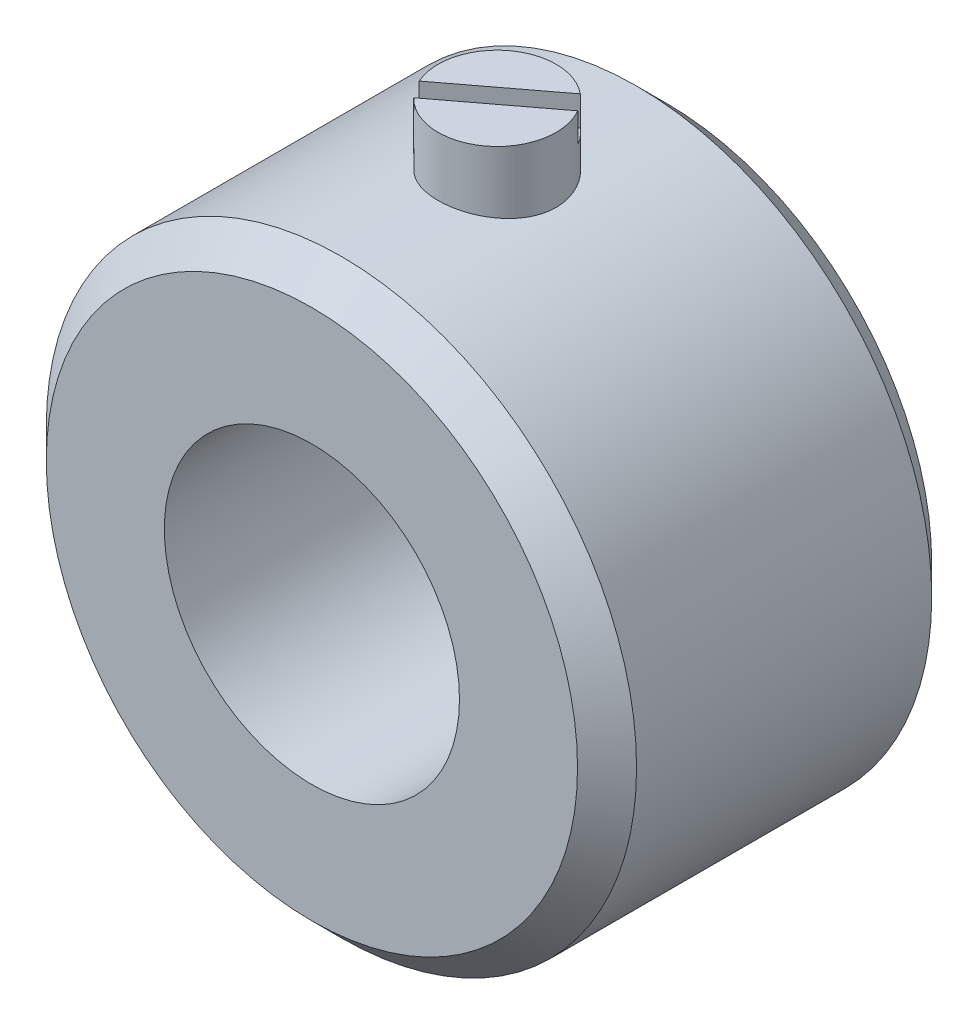
ISO-10303-21;
HEADER;
FILE_DESCRIPTION(('STEP AP214'),'2;1');
FILE_NAME('part.step','',(''),(''),'','','');
FILE_SCHEMA(('AUTOMOTIVE_DESIGN { 1 0 10303 214 1 1 1 1 }'));
ENDSEC;
DATA;
#1=APPLICATION_CONTEXT('core data for automotive mechanical design processes');
#2=APPLICATION_PROTOCOL_DEFINITION('international standard','automotive_design',2000,#1);
#3=PRODUCT_CONTEXT('',#1,'mechanical');
#4=PRODUCT('Part','Part','',(#3));
#5=PRODUCT_RELATED_PRODUCT_CATEGORY('part','',(#4));
#6=PRODUCT_DEFINITION_FORMATION('','',#4);
#7=PRODUCT_DEFINITION_CONTEXT('part definition',#1,'design');
#8=PRODUCT_DEFINITION('design','',#6,#7);
#9=PRODUCT_DEFINITION_SHAPE('','',#8);
#10=(LENGTH_UNIT() NAMED_UNIT(*) SI_UNIT(.MILLI.,.METRE.));
#11=(NAMED_UNIT(*) PLANE_ANGLE_UNIT() SI_UNIT($,.RADIAN.));
#12=(NAMED_UNIT(*) SI_UNIT($,.STERADIAN.) SOLID_ANGLE_UNIT());
#13=UNCERTAINTY_MEASURE_WITH_UNIT(LENGTH_MEASURE(1.E-05),#10,'distance_accuracy_value','');
#14=(GEOMETRIC_REPRESENTATION_CONTEXT(3) GLOBAL_UNCERTAINTY_ASSIGNED_CONTEXT((#13)) GLOBAL_UNIT_ASSIGNED_CONTEXT((#10,
#11,#12)) REPRESENTATION_CONTEXT('',''));
#15=CARTESIAN_POINT('',(0.,0.,0.));
#16=DIRECTION('',(0.,0.,1.));
#17=DIRECTION('',(1.,0.,0.));
#18=AXIS2_PLACEMENT_3D('',#15,#16,#17);
#19=CARTESIAN_POINT('',(0.,6.,2.86178119780479));
#20=DIRECTION('',(0.,1.,0.));
#21=DIRECTION('',(0.,0.,1.));
#22=AXIS2_PLACEMENT_3D('',#19,#20,#21);
#23=PLANE('',#22);
#24=DIRECTION('',(-0.79709214815401,0.,0.603857687995462));
#25=VECTOR('',#24,1.);
#26=CARTESIAN_POINT('',(-0.137444080898903,6.,2.68035501101824));
#27=LINE('',#26,#25);
#28=CARTESIAN_POINT('',(0.638726281455178,6.,2.09234716075));
#29=VERTEX_POINT('',#28);
#30=CARTESIAN_POINT('',(-0.913614443252984,6.,3.26836286128648));
#31=VERTEX_POINT('',#30);
#32=EDGE_CURVE('E82',#29,#31,#27,.T.);
#33=ORIENTED_EDGE('',*,*,#32,.F.);
#34=CARTESIAN_POINT('',(0.,6.,2.86178119780479));
#35=DIRECTION('',(0.,1.,0.));
#36=DIRECTION('',(0.,0.,1.));
#37=AXIS2_PLACEMENT_3D('',#34,#35,#36);
#38=CIRCLE('',#37,1.);
#39=EDGE_CURVE('E96',#29,#31,#38,.T.);
#40=ORIENTED_EDGE('',*,*,#39,.T.);
#41=EDGE_LOOP('',(#33,#40));
#42=FACE_BOUND('',#41,.T.);
#43=ADVANCED_FACE('F34',(#42),#23,.T.);
#44=CARTESIAN_POINT('',(0.,0.,6.));
#45=DIRECTION('',(0.,0.,-1.));
#46=DIRECTION('',(-1.,0.,0.));
#47=AXIS2_PLACEMENT_3D('',#44,#45,#46);
#48=CYLINDRICAL_SURFACE('',#47,5.);
#49=CARTESIAN_POINT('',(0.,0.,0.499999999999998));
#50=DIRECTION('',(0.,0.,1.));
#51=DIRECTION('',(1.,0.,0.));
#52=AXIS2_PLACEMENT_3D('',#49,#50,#51);
#53=CIRCLE('',#52,5.);
#54=CARTESIAN_POINT('',(5.,0.,0.499999999999998));
#55=VERTEX_POINT('',#54);
#56=EDGE_CURVE('E42',#55,#55,#53,.T.);
#57=ORIENTED_EDGE('',*,*,#56,.T.);
#58=EDGE_LOOP('',(#57));
#59=FACE_BOUND('',#58,.T.);
#60=CARTESIAN_POINT('',(0.,0.,5.5));
#61=DIRECTION('',(0.,0.,1.));
#62=DIRECTION('',(1.,0.,0.));
#63=AXIS2_PLACEMENT_3D('',#60,#61,#62);
#64=CIRCLE('',#63,5.);
#65=CARTESIAN_POINT('',(5.,0.,5.5));
#66=VERTEX_POINT('',#65);
#67=EDGE_CURVE('E112',#66,#66,#64,.F.);
#68=ORIENTED_EDGE('',*,*,#67,.T.);
#69=EDGE_LOOP('',(#68));
#70=FACE_BOUND('',#69,.T.);
#71=CARTESIAN_POINT('',(0.,5.,1.86178119780479));
#72=CARTESIAN_POINT('',(-0.0555769067926332,4.99999897580871,1.86178324230314));
#73=CARTESIAN_POINT('',(-0.111179660201522,4.99906385178231,1.86643004077244));
#74=CARTESIAN_POINT('',(-0.220813507689019,4.99542365623231,1.88487969792004));
#75=CARTESIAN_POINT('',(-0.274843317541356,4.99271717860186,1.8986898306063));
#76=CARTESIAN_POINT('',(-0.379730305263313,4.98583649278287,1.93502247142558));
#77=CARTESIAN_POINT('',(-0.430590467933134,4.98166369076718,1.95753663464948));
#78=CARTESIAN_POINT('',(-0.527807988864225,4.97230398035314,2.01061344531609));
#79=CARTESIAN_POINT('',(-0.574165615075812,4.96711713235707,2.041175613412));
#80=CARTESIAN_POINT('',(-0.661693477314865,4.9562216532997,2.10991969209622));
#81=CARTESIAN_POINT('',(-0.702793951158524,4.95050745504347,2.14818955319599));
#82=CARTESIAN_POINT('',(-0.778036756608028,4.93924180452588,2.23107361419649));
#83=CARTESIAN_POINT('',(-0.812178544770424,4.93369036500424,2.27568830913991));
#84=CARTESIAN_POINT('',(-0.87283175334762,4.92332441812615,2.37049739081667));
#85=CARTESIAN_POINT('',(-0.899270938865866,4.91851707364946,2.42073884160115));
#86=CARTESIAN_POINT('',(-0.943305666580308,4.91026268058418,2.52506301680887));
#87=CARTESIAN_POINT('',(-0.960902082437238,4.90681549761962,2.57914536115114));
#88=CARTESIAN_POINT('',(-0.986525299884827,4.90172805252204,2.68886556171271));
#89=CARTESIAN_POINT('',(-0.994674497958777,4.90006470107188,2.74447374194702));
#90=CARTESIAN_POINT('',(-1.00155212772612,4.89866375060627,2.85629101916913));
#91=CARTESIAN_POINT('',(-1.0002815227135,4.89892595467841,2.91250005412494));
#92=CARTESIAN_POINT('',(-0.988454573101819,4.90132551148185,3.02302798582579));
#93=CARTESIAN_POINT('',(-0.978038540243905,4.90343452858763,3.0773626034321));
#94=CARTESIAN_POINT('',(-0.948437884623051,4.90924546160001,3.18349727446779));
#95=CARTESIAN_POINT('',(-0.929252843100681,4.91294745357779,3.2352972067238));
#96=CARTESIAN_POINT('',(-0.88252478367472,4.92155618500408,3.33529645950839));
#97=CARTESIAN_POINT('',(-0.854926151232115,4.92647089813704,3.38346907737396));
#98=CARTESIAN_POINT('',(-0.792193574572679,4.93694618773062,3.47455204777761));
#99=CARTESIAN_POINT('',(-0.757058764356829,4.94250683838366,3.51746179465595));
#100=CARTESIAN_POINT('',(-0.679499934560584,4.95377021241462,3.59761060026173));
#101=CARTESIAN_POINT('',(-0.636956161212445,4.95947369210905,3.63473376566392));
#102=CARTESIAN_POINT('',(-0.54618502406201,4.97028848714408,3.70133504410602));
#103=CARTESIAN_POINT('',(-0.497957587379389,4.97539979488974,3.73081305909837));
#104=CARTESIAN_POINT('',(-0.397059386878921,4.98446690160887,3.78130870703077));
#105=CARTESIAN_POINT('',(-0.3443818195853,4.98842088848272,3.80231309144933));
#106=CARTESIAN_POINT('',(-0.236148976448665,4.99471408987858,3.83514167184336));
#107=CARTESIAN_POINT('',(-0.18059405007245,4.99705350000531,3.84696697987842));
#108=CARTESIAN_POINT('',(-0.0691794056271504,4.99982671866868,3.86093765159907));
#109=CARTESIAN_POINT('',(-0.0133403283255761,5.0002917465247,3.86324161734506));
#110=CARTESIAN_POINT('',(0.0979249341927141,4.99935051930103,3.85853133886261));
#111=CARTESIAN_POINT('',(0.153351142443793,4.99794436941446,3.8515176184522));
#112=CARTESIAN_POINT('',(0.261705659946541,4.99343832008018,3.82850282426083));
#113=CARTESIAN_POINT('',(0.314651948339903,4.99035376404206,3.81258312930689));
#114=CARTESIAN_POINT('',(0.417123627499667,4.98283552061033,3.77229721514898));
#115=CARTESIAN_POINT('',(0.46664876163754,4.97840173214227,3.74793036312796));
#116=CARTESIAN_POINT('',(0.561541173686218,4.96859911533294,3.69109870715348));
#117=CARTESIAN_POINT('',(0.606850126752188,4.96321950437052,3.65853841676585));
#118=CARTESIAN_POINT('',(0.691418019119207,4.95214734829882,3.58637200659751));
#119=CARTESIAN_POINT('',(0.730676308930762,4.94645476968388,3.54676513140492));
#120=CARTESIAN_POINT('',(0.802640590774176,4.93529303556965,3.46090784591367));
#121=CARTESIAN_POINT('',(0.835237702448655,4.92982860233304,3.41456545358345));
#122=CARTESIAN_POINT('',(0.892185420051206,4.91984191796194,3.31696983644811));
#123=CARTESIAN_POINT('',(0.916536355922903,4.91531962913342,3.26571680823124));
#124=CARTESIAN_POINT('',(0.95615184158196,4.90776740584383,3.16001295165524));
#125=CARTESIAN_POINT('',(0.971463499791051,4.90472974872187,3.10558035659447));
#126=CARTESIAN_POINT('',(0.992708651627196,4.90047436792025,2.99484774431389));
#127=CARTESIAN_POINT('',(0.998643368225112,4.89925640691111,2.93854797159544));
#128=CARTESIAN_POINT('',(1.00092091086747,4.89879149631379,2.82677233326047));
#129=CARTESIAN_POINT('',(0.997435788070896,4.89950919189301,2.77130004887778));
#130=CARTESIAN_POINT('',(0.981352304100061,4.90275573484614,2.66174954789976));
#131=CARTESIAN_POINT('',(0.968754016129298,4.90528456767169,2.60767132010999));
#132=CARTESIAN_POINT('',(0.934878568498954,4.91185264219158,2.50255348656425));
#133=CARTESIAN_POINT('',(0.913622506717345,4.9158882101883,2.45150683730238));
#134=CARTESIAN_POINT('',(0.863054644601604,4.9250171497417,2.35367747707035));
#135=CARTESIAN_POINT('',(0.833742168774882,4.93011060998894,2.30689512407965));
#136=CARTESIAN_POINT('',(0.767305914786414,4.94088960523225,2.21806562565448));
#137=CARTESIAN_POINT('',(0.73005788723518,4.94658372909699,2.1761124325372));
#138=CARTESIAN_POINT('',(0.649064369013141,4.95786081871955,2.09899499227562));
#139=CARTESIAN_POINT('',(0.605317387153335,4.96344375863184,2.06383230748752));
#140=CARTESIAN_POINT('',(0.512017629088246,4.97393832387971,2.00094655385834));
#141=CARTESIAN_POINT('',(0.462408884429835,4.97884231219246,1.97330519452477));
#142=CARTESIAN_POINT('',(0.359166360940733,4.98735125085,1.9267950752082));
#143=CARTESIAN_POINT('',(0.305536260863126,4.99095737138616,1.9079184082723));
#144=CARTESIAN_POINT('',(0.209821488923779,4.99576372595371,1.88312924976007));
#145=CARTESIAN_POINT('',(0.168281664013785,4.99734303158452,1.87513800409703));
#146=CARTESIAN_POINT('',(0.084499525210067,4.99946154139893,1.86446328544643));
#147=CARTESIAN_POINT('',(0.042257233748619,5.00000077873155,1.86177964329502));
#148=CARTESIAN_POINT('',(0.,5.,1.86178119780479));
#149=B_SPLINE_CURVE_WITH_KNOTS('',3,(#71,#72,#73,#74,#75,#76,#77,#78,#79,#80,#81,#82,#83,#84,
#85,#86,#87,#88,#89,#90,#91,#92,#93,#94,#95,#96,#97,#98,#99,#100,#101,#102,#103,#104,#105,#106,
#107,#108,#109,#110,#111,#112,#113,#114,#115,#116,#117,#118,#119,#120,#121,#122,#123,#124,#125,
#126,#127,#128,#129,#130,#131,#132,#133,#134,#135,#136,#137,#138,#139,#140,#141,#142,#143,#144,
#145,#146,#147,#148),.UNSPECIFIED.,.T.,.F.,(4,2,2,2,2,2,2,2,2,2,2,2,2,2,2,2,2,2,2,2,2,2,2,2,2,2,
2,2,2,2,2,2,2,2,2,2,2,2,4),(0.,0.166576130661258,0.333284650691323,0.499833735250341,
0.666372902230863,0.834932670112185,1.00350559674736,1.17361195005923,1.34370149365197,
1.51156185103587,1.67940504281225,1.84471727006278,2.0100373925373,2.17647490203593,
2.3429315474967,2.51238252491351,2.6818356753982,2.85155274854024,3.02124925698036,
3.18810735676265,3.35495607657868,3.52030453950723,3.68566539216022,3.85305066033359,
4.0204538834593,4.19040628579226,4.36035188723467,4.52940381032723,4.69843368330415,
4.86439722567702,5.03035943492608,5.1959196125311,5.36149367581867,5.52988076239143,
5.69830654532931,5.86849496675637,6.03852955517519,6.16518775289894,6.29184191370996),.UNSPECIFIED.);
#150=CARTESIAN_POINT('',(0.,5.,1.86178119780479));
#151=VERTEX_POINT('',#150);
#152=EDGE_CURVE('E83',#151,#151,#149,.T.);
#153=ORIENTED_EDGE('',*,*,#152,.F.);
#154=EDGE_LOOP('',(#153));
#155=FACE_BOUND('',#154,.T.);
#156=ADVANCED_FACE('F122',(#59,#70,#155),#48,.T.);
#157=CARTESIAN_POINT('',(0.,0.,6.));
#158=DIRECTION('',(0.,0.,1.));
#159=DIRECTION('',(1.,0.,0.));
#160=AXIS2_PLACEMENT_3D('',#157,#158,#159);
#161=PLANE('',#160);
#162=CARTESIAN_POINT('',(0.,0.,6.));
#163=DIRECTION('',(0.,0.,1.));
#164=DIRECTION('',(1.,0.,0.));
#165=AXIS2_PLACEMENT_3D('',#162,#163,#164);
#166=CIRCLE('',#165,4.5);
#167=CARTESIAN_POINT('',(4.5,0.,6.));
#168=VERTEX_POINT('',#167);
#169=EDGE_CURVE('E107',#168,#168,#166,.T.);
#170=ORIENTED_EDGE('',*,*,#169,.T.);
#171=EDGE_LOOP('',(#170));
#172=FACE_BOUND('',#171,.T.);
#173=CARTESIAN_POINT('',(0.,0.,6.));
#174=DIRECTION('',(0.,0.,1.));
#175=DIRECTION('',(1.,0.,0.));
#176=AXIS2_PLACEMENT_3D('',#173,#174,#175);
#177=CIRCLE('',#176,2.5);
#178=CARTESIAN_POINT('',(2.5,0.,6.));
#179=VERTEX_POINT('',#178);
#180=EDGE_CURVE('E104',#179,#179,#177,.T.);
#181=ORIENTED_EDGE('',*,*,#180,.F.);
#182=EDGE_LOOP('',(#181));
#183=FACE_BOUND('',#182,.T.);
#184=ADVANCED_FACE('F136',(#172,#183),#161,.T.);
#185=CARTESIAN_POINT('',(0.,0.,0.));
#186=DIRECTION('',(0.,0.,1.));
#187=DIRECTION('',(1.,0.,0.));
#188=AXIS2_PLACEMENT_3D('',#185,#186,#187);
#189=PLANE('',#188);
#190=CARTESIAN_POINT('',(0.,0.,0.));
#191=DIRECTION('',(0.,0.,1.));
#192=DIRECTION('',(1.,0.,0.));
#193=AXIS2_PLACEMENT_3D('',#190,#191,#192);
#194=CIRCLE('',#193,4.5);
#195=CARTESIAN_POINT('',(4.5,0.,0.));
#196=VERTEX_POINT('',#195);
#197=EDGE_CURVE('E11',#196,#196,#194,.F.);
#198=ORIENTED_EDGE('',*,*,#197,.T.);
#199=EDGE_LOOP('',(#198));
#200=FACE_BOUND('',#199,.T.);
#201=CARTESIAN_POINT('',(0.,0.,0.));
#202=DIRECTION('',(0.,0.,1.));
#203=DIRECTION('',(1.,0.,0.));
#204=AXIS2_PLACEMENT_3D('',#201,#202,#203);
#205=CIRCLE('',#204,2.5);
#206=CARTESIAN_POINT('',(2.5,0.,0.));
#207=VERTEX_POINT('',#206);
#208=EDGE_CURVE('E100',#207,#207,#205,.T.);
#209=ORIENTED_EDGE('',*,*,#208,.T.);
#210=EDGE_LOOP('',(#209));
#211=FACE_BOUND('',#210,.T.);
#212=ADVANCED_FACE('F134',(#200,#211),#189,.F.);
#213=CARTESIAN_POINT('',(0.,0.,6.));
#214=DIRECTION('',(0.,0.,-1.));
#215=DIRECTION('',(-1.,0.,0.));
#216=AXIS2_PLACEMENT_3D('',#213,#214,#215);
#217=CYLINDRICAL_SURFACE('',#216,2.5);
#218=ORIENTED_EDGE('',*,*,#180,.T.);
#219=EDGE_LOOP('',(#218));
#220=FACE_BOUND('',#219,.T.);
#221=ORIENTED_EDGE('',*,*,#208,.F.);
#222=EDGE_LOOP('',(#221));
#223=FACE_BOUND('',#222,.T.);
#224=ADVANCED_FACE('F131',(#220,#223),#217,.F.);
#225=CARTESIAN_POINT('',(0.,0.,6.));
#226=DIRECTION('',(0.,0.,-1.));
#227=DIRECTION('',(-1.,0.,0.));
#228=AXIS2_PLACEMENT_3D('',#225,#226,#227);
#229=CONICAL_SURFACE('',#228,4.5,0.785398163397447);
#230=ORIENTED_EDGE('',*,*,#67,.F.);
#231=EDGE_LOOP('',(#230));
#232=FACE_BOUND('',#231,.T.);
#233=ORIENTED_EDGE('',*,*,#169,.F.);
#234=EDGE_LOOP('',(#233));
#235=FACE_BOUND('',#234,.T.);
#236=ADVANCED_FACE('F129',(#232,#235),#229,.T.);
#237=CARTESIAN_POINT('',(0.,6.,2.86178119780479));
#238=DIRECTION('',(0.,-1.,0.));
#239=DIRECTION('',(0.,0.,-1.));
#240=AXIS2_PLACEMENT_3D('',#237,#238,#239);
#241=CYLINDRICAL_SURFACE('',#240,1.);
#242=ORIENTED_EDGE('',*,*,#39,.F.);
#243=DIRECTION('',(0.,-1.,0.));
#244=VECTOR('',#243,1.);
#245=CARTESIAN_POINT('',(0.638726281455179,6.,2.09234716075));
#246=LINE('',#245,#244);
#247=CARTESIAN_POINT('',(0.638726281455178,5.5,2.09234716075));
#248=VERTEX_POINT('',#247);
#249=EDGE_CURVE('E97',#29,#248,#246,.T.);
#250=ORIENTED_EDGE('',*,*,#249,.T.);
#251=CARTESIAN_POINT('',(0.,5.5,2.86178119780479));
#252=DIRECTION('',(0.,-1.,0.));
#253=DIRECTION('',(0.,0.,-1.));
#254=AXIS2_PLACEMENT_3D('',#251,#252,#253);
#255=CIRCLE('',#254,1.);
#256=CARTESIAN_POINT('',(0.866418463188751,5.5,2.36246261548921));
#257=VERTEX_POINT('',#256);
#258=EDGE_CURVE('E92',#248,#257,#255,.T.);
#259=ORIENTED_EDGE('',*,*,#258,.T.);
#260=DIRECTION('',(0.,-1.,0.));
#261=VECTOR('',#260,1.);
#262=CARTESIAN_POINT('',(0.866418463188751,6.,2.36246261548921));
#263=LINE('',#262,#261);
#264=CARTESIAN_POINT('',(0.866418463188751,6.,2.36246261548921));
#265=VERTEX_POINT('',#264);
#266=EDGE_CURVE('E77',#257,#265,#263,.F.);
#267=ORIENTED_EDGE('',*,*,#266,.T.);
#268=CARTESIAN_POINT('',(-0.715223936837976,6.,3.5606765549034));
#269=VERTEX_POINT('',#268);
#270=EDGE_CURVE('E90',#269,#265,#38,.T.);
#271=ORIENTED_EDGE('',*,*,#270,.F.);
#272=DIRECTION('',(0.,-1.,0.));
#273=VECTOR('',#272,1.);
#274=CARTESIAN_POINT('',(-0.715223936837976,6.,3.5606765549034));
#275=LINE('',#274,#273);
#276=CARTESIAN_POINT('',(-0.715223936837976,5.5,3.5606765549034));
#277=VERTEX_POINT('',#276);
#278=EDGE_CURVE('E49',#269,#277,#275,.T.);
#279=ORIENTED_EDGE('',*,*,#278,.T.);
#280=CARTESIAN_POINT('',(-0.913614443252984,5.5,3.26836286128648));
#281=VERTEX_POINT('',#280);
#282=EDGE_CURVE('E174',#277,#281,#255,.T.);
#283=ORIENTED_EDGE('',*,*,#282,.T.);
#284=DIRECTION('',(0.,-1.,0.));
#285=VECTOR('',#284,1.);
#286=CARTESIAN_POINT('',(-0.913614443252984,6.,3.26836286128648));
#287=LINE('',#286,#285);
#288=EDGE_CURVE('E57',#281,#31,#287,.F.);
#289=ORIENTED_EDGE('',*,*,#288,.T.);
#290=EDGE_LOOP('',(#242,#250,#259,#267,#271,#279,#283,#289));
#291=FACE_BOUND('',#290,.T.);
#292=ORIENTED_EDGE('',*,*,#152,.T.);
#293=EDGE_LOOP('',(#292));
#294=FACE_BOUND('',#293,.T.);
#295=ADVANCED_FACE('F88',(#291,#294),#241,.T.);
#296=DIRECTION('',(0.79709214815401,0.,-0.603857687995463));
#297=VECTOR('',#296,1.);
#298=CARTESIAN_POINT('',(0.0755972631753872,6.,2.9615695851963));
#299=LINE('',#298,#297);
#300=EDGE_CURVE('E74',#269,#265,#299,.T.);
#301=ORIENTED_EDGE('',*,*,#300,.F.);
#302=ORIENTED_EDGE('',*,*,#270,.T.);
#303=EDGE_LOOP('',(#301,#302));
#304=FACE_BOUND('',#303,.T.);
#305=ADVANCED_FACE('F95',(#304),#23,.T.);
#306=CARTESIAN_POINT('',(0.,5.5,0.));
#307=DIRECTION('',(0.,-1.,0.));
#308=DIRECTION('',(0.,0.,-1.));
#309=AXIS2_PLACEMENT_3D('',#306,#307,#308);
#310=PLANE('',#309);
#311=DIRECTION('',(-0.79709214815401,0.,0.603857687995462));
#312=VECTOR('',#311,1.);
#313=CARTESIAN_POINT('',(-1.13522953949166,5.5,3.43625308570972));
#314=LINE('',#313,#312);
#315=EDGE_CURVE('E93',#248,#281,#314,.T.);
#316=ORIENTED_EDGE('',*,*,#315,.T.);
#317=ORIENTED_EDGE('',*,*,#282,.F.);
#318=DIRECTION('',(0.79709214815401,0.,-0.603857687995463));
#319=VECTOR('',#318,1.);
#320=CARTESIAN_POINT('',(1.10502090344527,5.5,2.18170319105245));
#321=LINE('',#320,#319);
#322=EDGE_CURVE('E180',#277,#257,#321,.T.);
#323=ORIENTED_EDGE('',*,*,#322,.T.);
#324=ORIENTED_EDGE('',*,*,#258,.F.);
#325=EDGE_LOOP('',(#316,#317,#323,#324));
#326=FACE_BOUND('',#325,.T.);
#327=ADVANCED_FACE('F152',(#326),#310,.F.);
#328=CARTESIAN_POINT('',(-1.13522953949166,5.5,3.43625308570972));
#329=DIRECTION('',(-0.603857687995462,0.,-0.79709214815401));
#330=DIRECTION('',(-0.79709214815401,0.,0.603857687995462));
#331=AXIS2_PLACEMENT_3D('',#328,#329,#330);
#332=PLANE('',#331);
#333=ORIENTED_EDGE('',*,*,#32,.T.);
#334=ORIENTED_EDGE('',*,*,#288,.F.);
#335=ORIENTED_EDGE('',*,*,#315,.F.);
#336=ORIENTED_EDGE('',*,*,#249,.F.);
#337=EDGE_LOOP('',(#333,#334,#335,#336));
#338=FACE_BOUND('',#337,.T.);
#339=ADVANCED_FACE('F156',(#338),#332,.F.);
#340=CARTESIAN_POINT('',(1.10502090344527,5.5,2.18170319105245));
#341=DIRECTION('',(0.603857687995463,0.,0.79709214815401));
#342=DIRECTION('',(0.79709214815401,0.,-0.603857687995463));
#343=AXIS2_PLACEMENT_3D('',#340,#341,#342);
#344=PLANE('',#343);
#345=ORIENTED_EDGE('',*,*,#300,.T.);
#346=ORIENTED_EDGE('',*,*,#266,.F.);
#347=ORIENTED_EDGE('',*,*,#322,.F.);
#348=ORIENTED_EDGE('',*,*,#278,.F.);
#349=EDGE_LOOP('',(#345,#346,#347,#348));
#350=FACE_BOUND('',#349,.T.);
#351=ADVANCED_FACE('F76',(#350),#344,.F.);
#352=CARTESIAN_POINT('',(0.,0.,0.499999999999998));
#353=DIRECTION('',(0.,0.,1.));
#354=DIRECTION('',(1.,0.,0.));
#355=AXIS2_PLACEMENT_3D('',#352,#353,#354);
#356=CONICAL_SURFACE('',#355,5.,0.785398163397451);
#357=ORIENTED_EDGE('',*,*,#197,.F.);
#358=EDGE_LOOP('',(#357));
#359=FACE_BOUND('',#358,.T.);
#360=ORIENTED_EDGE('',*,*,#56,.F.);
#361=EDGE_LOOP('',(#360));
#362=FACE_BOUND('',#361,.T.);
#363=ADVANCED_FACE('F36',(#359,#362),#356,.T.);
#364=CLOSED_SHELL('',(#43,#156,#184,#212,#224,#236,#295,#305,#327,#339,#351,#363));
#365=MANIFOLD_SOLID_BREP('B2',#364);
#366=ADVANCED_BREP_SHAPE_REPRESENTATION('',(#18,#365),#14);
#367=SHAPE_DEFINITION_REPRESENTATION(#9,#366);
ENDSEC;
END-ISO-10303-21;
